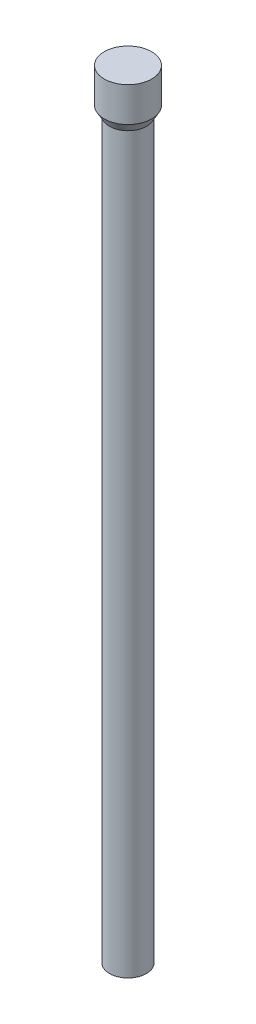
ISO-10303-21;
HEADER;
FILE_DESCRIPTION(('STEP AP214'),'2;1');
FILE_NAME('part.step','',(''),(''),'','','');
FILE_SCHEMA(('AUTOMOTIVE_DESIGN { 1 0 10303 214 1 1 1 1 }'));
ENDSEC;
DATA;
#1=APPLICATION_CONTEXT('core data for automotive mechanical design processes');
#2=APPLICATION_PROTOCOL_DEFINITION('international standard','automotive_design',2000,#1);
#3=PRODUCT_CONTEXT('',#1,'mechanical');
#4=PRODUCT('Part','Part','',(#3));
#5=PRODUCT_RELATED_PRODUCT_CATEGORY('part','',(#4));
#6=PRODUCT_DEFINITION_FORMATION('','',#4);
#7=PRODUCT_DEFINITION_CONTEXT('part definition',#1,'design');
#8=PRODUCT_DEFINITION('design','',#6,#7);
#9=PRODUCT_DEFINITION_SHAPE('','',#8);
#10=(LENGTH_UNIT() NAMED_UNIT(*) SI_UNIT(.MILLI.,.METRE.));
#11=(NAMED_UNIT(*) PLANE_ANGLE_UNIT() SI_UNIT($,.RADIAN.));
#12=(NAMED_UNIT(*) SI_UNIT($,.STERADIAN.) SOLID_ANGLE_UNIT());
#13=UNCERTAINTY_MEASURE_WITH_UNIT(LENGTH_MEASURE(1.E-05),#10,'distance_accuracy_value','');
#14=(GEOMETRIC_REPRESENTATION_CONTEXT(3) GLOBAL_UNCERTAINTY_ASSIGNED_CONTEXT((#13)) GLOBAL_UNIT_ASSIGNED_CONTEXT((#10,
#11,#12)) REPRESENTATION_CONTEXT('',''));
#15=CARTESIAN_POINT('',(0.,0.,0.));
#16=DIRECTION('',(0.,0.,1.));
#17=DIRECTION('',(1.,0.,0.));
#18=AXIS2_PLACEMENT_3D('',#15,#16,#17);
#19=CARTESIAN_POINT('',(0.,2.,0.));
#20=DIRECTION('',(0.,-1.,0.));
#21=DIRECTION('',(0.,0.,-1.));
#22=AXIS2_PLACEMENT_3D('',#19,#20,#21);
#23=CYLINDRICAL_SURFACE('',#22,2.5);
#24=CARTESIAN_POINT('',(0.,-1.64544826719048,0.));
#25=DIRECTION('',(0.,1.,0.));
#26=DIRECTION('',(0.,0.,1.));
#27=AXIS2_PLACEMENT_3D('',#24,#25,#26);
#28=CIRCLE('',#27,2.5);
#29=CARTESIAN_POINT('',(0.,-1.64544826719048,2.5));
#30=VERTEX_POINT('',#29);
#31=EDGE_CURVE('E10',#30,#30,#28,.T.);
#32=ORIENTED_EDGE('',*,*,#31,.T.);
#33=EDGE_LOOP('',(#32));
#34=FACE_BOUND('',#33,.T.);
#35=CARTESIAN_POINT('',(0.,2.,0.));
#36=DIRECTION('',(0.,1.,0.));
#37=DIRECTION('',(0.,0.,1.));
#38=AXIS2_PLACEMENT_3D('',#35,#36,#37);
#39=CIRCLE('',#38,2.5);
#40=CARTESIAN_POINT('',(0.,2.,2.5));
#41=VERTEX_POINT('',#40);
#42=EDGE_CURVE('E47',#41,#41,#39,.T.);
#43=ORIENTED_EDGE('',*,*,#42,.F.);
#44=EDGE_LOOP('',(#43));
#45=FACE_BOUND('',#44,.T.);
#46=ADVANCED_FACE('F35',(#34,#45),#23,.T.);
#47=CARTESIAN_POINT('',(0.,2.,0.));
#48=DIRECTION('',(0.,1.,0.));
#49=DIRECTION('',(0.,0.,1.));
#50=AXIS2_PLACEMENT_3D('',#47,#48,#49);
#51=PLANE('',#50);
#52=ORIENTED_EDGE('',*,*,#42,.T.);
#53=EDGE_LOOP('',(#52));
#54=FACE_BOUND('',#53,.T.);
#55=ADVANCED_FACE('F61',(#54),#51,.T.);
#56=CARTESIAN_POINT('',(0.,-80.,0.));
#57=DIRECTION('',(0.,1.,0.));
#58=DIRECTION('',(0.,0.,1.));
#59=AXIS2_PLACEMENT_3D('',#56,#57,#58);
#60=CYLINDRICAL_SURFACE('',#59,1.95);
#61=CARTESIAN_POINT('',(0.,-2.59807621135337,0.));
#62=DIRECTION('',(0.,1.,0.));
#63=DIRECTION('',(0.,0.,1.));
#64=AXIS2_PLACEMENT_3D('',#61,#62,#63);
#65=CIRCLE('',#64,1.95);
#66=CARTESIAN_POINT('',(0.,-2.59807621135337,1.95));
#67=VERTEX_POINT('',#66);
#68=EDGE_CURVE('E43',#67,#67,#65,.F.);
#69=ORIENTED_EDGE('',*,*,#68,.T.);
#70=EDGE_LOOP('',(#69));
#71=FACE_BOUND('',#70,.T.);
#72=CARTESIAN_POINT('',(0.,-80.,0.));
#73=DIRECTION('',(0.,-1.,0.));
#74=DIRECTION('',(0.,0.,-1.));
#75=AXIS2_PLACEMENT_3D('',#72,#73,#74);
#76=CIRCLE('',#75,1.95);
#77=CARTESIAN_POINT('',(0.,-80.,-1.95));
#78=VERTEX_POINT('',#77);
#79=EDGE_CURVE('E51',#78,#78,#76,.T.);
#80=ORIENTED_EDGE('',*,*,#79,.F.);
#81=EDGE_LOOP('',(#80));
#82=FACE_BOUND('',#81,.T.);
#83=ADVANCED_FACE('F59',(#71,#82),#60,.T.);
#84=CARTESIAN_POINT('',(0.,-80.,0.));
#85=DIRECTION('',(0.,-1.,0.));
#86=DIRECTION('',(0.,0.,-1.));
#87=AXIS2_PLACEMENT_3D('',#84,#85,#86);
#88=PLANE('',#87);
#89=ORIENTED_EDGE('',*,*,#79,.T.);
#90=EDGE_LOOP('',(#89));
#91=FACE_BOUND('',#90,.T.);
#92=ADVANCED_FACE('F57',(#91),#88,.T.);
#93=CARTESIAN_POINT('',(0.,-2.59807621135337,0.));
#94=DIRECTION('',(0.,1.,0.));
#95=DIRECTION('',(0.,0.,1.));
#96=AXIS2_PLACEMENT_3D('',#93,#94,#95);
#97=CONICAL_SURFACE('',#96,1.95,0.523598775598295);
#98=ORIENTED_EDGE('',*,*,#31,.F.);
#99=EDGE_LOOP('',(#98));
#100=FACE_BOUND('',#99,.T.);
#101=ORIENTED_EDGE('',*,*,#68,.F.);
#102=EDGE_LOOP('',(#101));
#103=FACE_BOUND('',#102,.T.);
#104=ADVANCED_FACE('F38',(#100,#103),#97,.T.);
#105=CLOSED_SHELL('',(#46,#55,#83,#92,#104));
#106=MANIFOLD_SOLID_BREP('B2',#105);
#107=ADVANCED_BREP_SHAPE_REPRESENTATION('',(#18,#106),#14);
#108=SHAPE_DEFINITION_REPRESENTATION(#9,#107);
ENDSEC;
END-ISO-10303-21;
